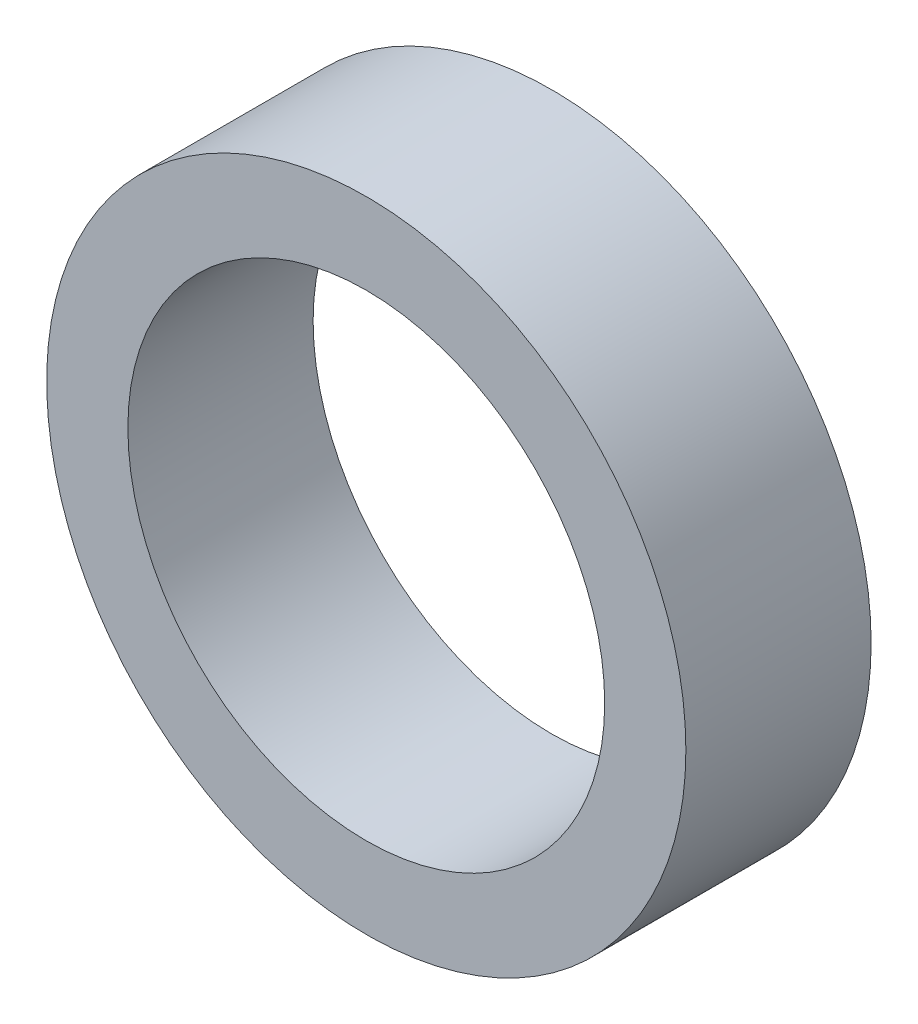
ISO-10303-21;
HEADER;
FILE_DESCRIPTION(('STEP AP214'),'2;1');
FILE_NAME('part.step','',(''),(''),'','','');
FILE_SCHEMA(('AUTOMOTIVE_DESIGN { 1 0 10303 214 1 1 1 1 }'));
ENDSEC;
DATA;
#1=APPLICATION_CONTEXT('core data for automotive mechanical design processes');
#2=APPLICATION_PROTOCOL_DEFINITION('international standard','automotive_design',2000,#1);
#3=PRODUCT_CONTEXT('',#1,'mechanical');
#4=PRODUCT('Part','Part','',(#3));
#5=PRODUCT_RELATED_PRODUCT_CATEGORY('part','',(#4));
#6=PRODUCT_DEFINITION_FORMATION('','',#4);
#7=PRODUCT_DEFINITION_CONTEXT('part definition',#1,'design');
#8=PRODUCT_DEFINITION('design','',#6,#7);
#9=PRODUCT_DEFINITION_SHAPE('','',#8);
#10=(LENGTH_UNIT() NAMED_UNIT(*) SI_UNIT(.MILLI.,.METRE.));
#11=(NAMED_UNIT(*) PLANE_ANGLE_UNIT() SI_UNIT($,.RADIAN.));
#12=(NAMED_UNIT(*) SI_UNIT($,.STERADIAN.) SOLID_ANGLE_UNIT());
#13=UNCERTAINTY_MEASURE_WITH_UNIT(LENGTH_MEASURE(1.E-05),#10,'distance_accuracy_value','');
#14=(GEOMETRIC_REPRESENTATION_CONTEXT(3) GLOBAL_UNCERTAINTY_ASSIGNED_CONTEXT((#13)) GLOBAL_UNIT_ASSIGNED_CONTEXT((#10,
#11,#12)) REPRESENTATION_CONTEXT('',''));
#15=CARTESIAN_POINT('',(0.,0.,0.));
#16=DIRECTION('',(0.,0.,1.));
#17=DIRECTION('',(1.,0.,0.));
#18=AXIS2_PLACEMENT_3D('',#15,#16,#17);
#19=CARTESIAN_POINT('',(0.,0.,4.1148));
#20=DIRECTION('',(0.,0.,1.));
#21=DIRECTION('',(1.,0.,0.));
#22=AXIS2_PLACEMENT_3D('',#19,#20,#21);
#23=CYLINDRICAL_SURFACE('',#22,10.5918);
#24=CARTESIAN_POINT('',(0.,0.,0.));
#25=DIRECTION('',(0.,0.,1.));
#26=DIRECTION('',(1.,0.,0.));
#27=AXIS2_PLACEMENT_3D('',#24,#25,#26);
#28=CIRCLE('',#27,10.5918);
#29=CARTESIAN_POINT('',(10.5918,0.,0.));
#30=VERTEX_POINT('',#29);
#31=EDGE_CURVE('E18',#30,#30,#28,.T.);
#32=ORIENTED_EDGE('',*,*,#31,.F.);
#33=EDGE_LOOP('',(#32));
#34=FACE_BOUND('',#33,.T.);
#35=CARTESIAN_POINT('',(0.,0.,8.2296));
#36=DIRECTION('',(0.,0.,1.));
#37=DIRECTION('',(1.,0.,0.));
#38=AXIS2_PLACEMENT_3D('',#35,#36,#37);
#39=CIRCLE('',#38,10.5918);
#40=CARTESIAN_POINT('',(10.5918,0.,8.2296));
#41=VERTEX_POINT('',#40);
#42=EDGE_CURVE('E27',#41,#41,#39,.F.);
#43=ORIENTED_EDGE('',*,*,#42,.F.);
#44=EDGE_LOOP('',(#43));
#45=FACE_BOUND('',#44,.T.);
#46=ADVANCED_FACE('F15',(#34,#45),#23,.F.);
#47=CARTESIAN_POINT('',(0.,0.,0.));
#48=DIRECTION('',(0.,0.,-1.));
#49=DIRECTION('',(-1.,0.,0.));
#50=AXIS2_PLACEMENT_3D('',#47,#48,#49);
#51=PLANE('',#50);
#52=ORIENTED_EDGE('',*,*,#31,.T.);
#53=EDGE_LOOP('',(#52));
#54=FACE_BOUND('',#53,.T.);
#55=CARTESIAN_POINT('',(0.,0.,0.));
#56=DIRECTION('',(0.,0.,1.));
#57=DIRECTION('',(1.,0.,0.));
#58=AXIS2_PLACEMENT_3D('',#55,#56,#57);
#59=CIRCLE('',#58,14.1986);
#60=CARTESIAN_POINT('',(14.1986,0.,0.));
#61=VERTEX_POINT('',#60);
#62=EDGE_CURVE('E22',#61,#61,#59,.T.);
#63=ORIENTED_EDGE('',*,*,#62,.F.);
#64=EDGE_LOOP('',(#63));
#65=FACE_BOUND('',#64,.T.);
#66=ADVANCED_FACE('F35',(#54,#65),#51,.T.);
#67=CARTESIAN_POINT('',(0.,0.,8.2296));
#68=DIRECTION('',(0.,0.,1.));
#69=DIRECTION('',(1.,0.,0.));
#70=AXIS2_PLACEMENT_3D('',#67,#68,#69);
#71=PLANE('',#70);
#72=ORIENTED_EDGE('',*,*,#42,.T.);
#73=EDGE_LOOP('',(#72));
#74=FACE_BOUND('',#73,.T.);
#75=CARTESIAN_POINT('',(0.,0.,8.2296));
#76=DIRECTION('',(0.,0.,1.));
#77=DIRECTION('',(1.,0.,0.));
#78=AXIS2_PLACEMENT_3D('',#75,#76,#77);
#79=CIRCLE('',#78,14.1986);
#80=CARTESIAN_POINT('',(14.1986,0.,8.2296));
#81=VERTEX_POINT('',#80);
#82=EDGE_CURVE('E10',#81,#81,#79,.F.);
#83=ORIENTED_EDGE('',*,*,#82,.F.);
#84=EDGE_LOOP('',(#83));
#85=FACE_BOUND('',#84,.T.);
#86=ADVANCED_FACE('F44',(#74,#85),#71,.T.);
#87=CARTESIAN_POINT('',(0.,0.,0.));
#88=DIRECTION('',(0.,0.,1.));
#89=DIRECTION('',(1.,0.,0.));
#90=AXIS2_PLACEMENT_3D('',#87,#88,#89);
#91=CYLINDRICAL_SURFACE('',#90,14.1986);
#92=ORIENTED_EDGE('',*,*,#82,.T.);
#93=EDGE_LOOP('',(#92));
#94=FACE_BOUND('',#93,.T.);
#95=ORIENTED_EDGE('',*,*,#62,.T.);
#96=EDGE_LOOP('',(#95));
#97=FACE_BOUND('',#96,.T.);
#98=ADVANCED_FACE('F45',(#94,#97),#91,.T.);
#99=CLOSED_SHELL('',(#46,#66,#86,#98));
#100=MANIFOLD_SOLID_BREP('B1',#99);
#101=ADVANCED_BREP_SHAPE_REPRESENTATION('',(#18,#100),#14);
#102=SHAPE_DEFINITION_REPRESENTATION(#9,#101);
ENDSEC;
END-ISO-10303-21;
